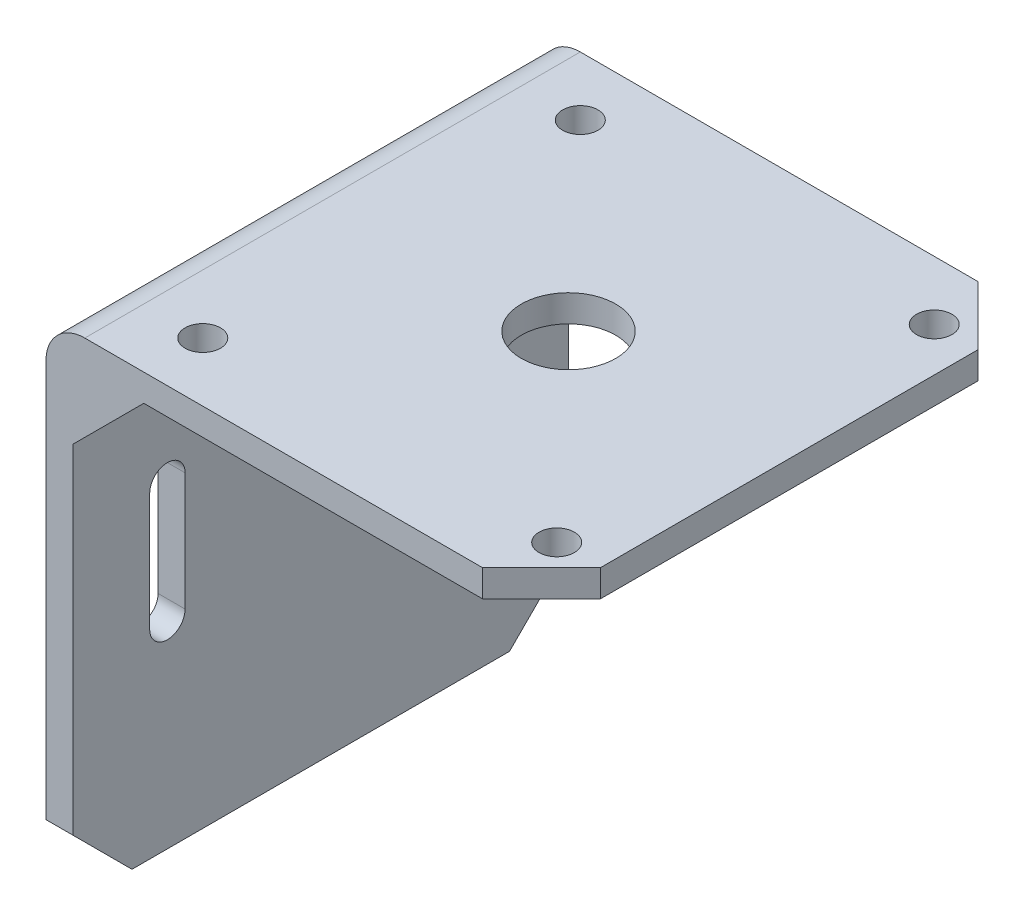
ISO-10303-21;
HEADER;
FILE_DESCRIPTION(('STEP AP214'),'2;1');
FILE_NAME('part.step','',(''),(''),'','','');
FILE_SCHEMA(('AUTOMOTIVE_DESIGN { 1 0 10303 214 1 1 1 1 }'));
ENDSEC;
DATA;
#1=APPLICATION_CONTEXT('core data for automotive mechanical design processes');
#2=APPLICATION_PROTOCOL_DEFINITION('international standard','automotive_design',2000,#1);
#3=PRODUCT_CONTEXT('',#1,'mechanical');
#4=PRODUCT('Part','Part','',(#3));
#5=PRODUCT_RELATED_PRODUCT_CATEGORY('part','',(#4));
#6=PRODUCT_DEFINITION_FORMATION('','',#4);
#7=PRODUCT_DEFINITION_CONTEXT('part definition',#1,'design');
#8=PRODUCT_DEFINITION('design','',#6,#7);
#9=PRODUCT_DEFINITION_SHAPE('','',#8);
#10=(LENGTH_UNIT() NAMED_UNIT(*) SI_UNIT(.MILLI.,.METRE.));
#11=(NAMED_UNIT(*) PLANE_ANGLE_UNIT() SI_UNIT($,.RADIAN.));
#12=(NAMED_UNIT(*) SI_UNIT($,.STERADIAN.) SOLID_ANGLE_UNIT());
#13=UNCERTAINTY_MEASURE_WITH_UNIT(LENGTH_MEASURE(1.E-05),#10,'distance_accuracy_value','');
#14=(GEOMETRIC_REPRESENTATION_CONTEXT(3) GLOBAL_UNCERTAINTY_ASSIGNED_CONTEXT((#13)) GLOBAL_UNIT_ASSIGNED_CONTEXT((#10,
#11,#12)) REPRESENTATION_CONTEXT('',''));
#15=CARTESIAN_POINT('',(0.,0.,0.));
#16=DIRECTION('',(0.,0.,1.));
#17=DIRECTION('',(1.,0.,0.));
#18=AXIS2_PLACEMENT_3D('',#15,#16,#17);
#19=CARTESIAN_POINT('',(3.29,38.71,42.));
#20=DIRECTION('',(0.,0.,-1.));
#21=DIRECTION('',(-1.,0.,0.));
#22=AXIS2_PLACEMENT_3D('',#19,#20,#21);
#23=CYLINDRICAL_SURFACE('',#22,1.);
#24=CARTESIAN_POINT('',(3.29,38.71,2.));
#25=DIRECTION('',(0.,0.,1.));
#26=DIRECTION('',(1.,0.,0.));
#27=AXIS2_PLACEMENT_3D('',#24,#25,#26);
#28=CIRCLE('',#27,1.);
#29=CARTESIAN_POINT('',(3.29,39.71,2.00000000000002));
#30=VERTEX_POINT('',#29);
#31=CARTESIAN_POINT('',(2.29,38.71,2.00000000000002));
#32=VERTEX_POINT('',#31);
#33=EDGE_CURVE('E72',#30,#32,#28,.T.);
#34=ORIENTED_EDGE('',*,*,#33,.F.);
#35=DIRECTION('',(0.,0.,-1.));
#36=VECTOR('',#35,1.);
#37=CARTESIAN_POINT('',(3.29,39.71,42.));
#38=LINE('',#37,#36);
#39=CARTESIAN_POINT('',(3.29,39.71,40.));
#40=VERTEX_POINT('',#39);
#41=EDGE_CURVE('E429',#40,#30,#38,.T.);
#42=ORIENTED_EDGE('',*,*,#41,.F.);
#43=CARTESIAN_POINT('',(3.29,38.71,40.));
#44=DIRECTION('',(0.,0.,1.));
#45=DIRECTION('',(1.,0.,0.));
#46=AXIS2_PLACEMENT_3D('',#43,#44,#45);
#47=CIRCLE('',#46,1.);
#48=CARTESIAN_POINT('',(2.29,38.71,40.));
#49=VERTEX_POINT('',#48);
#50=EDGE_CURVE('E259',#40,#49,#47,.T.);
#51=ORIENTED_EDGE('',*,*,#50,.T.);
#52=DIRECTION('',(0.,0.,-1.));
#53=VECTOR('',#52,1.);
#54=CARTESIAN_POINT('',(2.29,38.71,42.));
#55=LINE('',#54,#53);
#56=EDGE_CURVE('E444',#49,#32,#55,.T.);
#57=ORIENTED_EDGE('',*,*,#56,.T.);
#58=EDGE_LOOP('',(#34,#42,#51,#57));
#59=FACE_BOUND('',#58,.T.);
#60=ADVANCED_FACE('F47',(#59),#23,.F.);
#61=CARTESIAN_POINT('',(0.,39.71,42.));
#62=DIRECTION('',(0.,1.,0.));
#63=DIRECTION('',(0.,0.,1.));
#64=AXIS2_PLACEMENT_3D('',#61,#62,#63);
#65=PLANE('',#64);
#66=CARTESIAN_POINT('',(8.29,39.71,5.));
#67=DIRECTION('',(0.,1.,0.));
#68=DIRECTION('',(0.,0.,1.));
#69=AXIS2_PLACEMENT_3D('',#66,#67,#68);
#70=CIRCLE('',#69,1.5);
#71=CARTESIAN_POINT('',(8.29,39.71,6.5));
#72=VERTEX_POINT('',#71);
#73=EDGE_CURVE('E235',#72,#72,#70,.F.);
#74=ORIENTED_EDGE('',*,*,#73,.F.);
#75=EDGE_LOOP('',(#74));
#76=FACE_BOUND('',#75,.T.);
#77=CARTESIAN_POINT('',(23.29,39.71,21.));
#78=DIRECTION('',(0.,1.,0.));
#79=DIRECTION('',(0.,0.,1.));
#80=AXIS2_PLACEMENT_3D('',#77,#78,#79);
#81=CIRCLE('',#80,4.);
#82=CARTESIAN_POINT('',(23.29,39.71,25.));
#83=VERTEX_POINT('',#82);
#84=EDGE_CURVE('E373',#83,#83,#81,.F.);
#85=ORIENTED_EDGE('',*,*,#84,.F.);
#86=EDGE_LOOP('',(#85));
#87=FACE_BOUND('',#86,.T.);
#88=CARTESIAN_POINT('',(38.29,39.71,5.));
#89=DIRECTION('',(0.,1.,0.));
#90=DIRECTION('',(0.,0.,1.));
#91=AXIS2_PLACEMENT_3D('',#88,#89,#90);
#92=CIRCLE('',#91,1.5);
#93=CARTESIAN_POINT('',(38.29,39.71,6.5));
#94=VERTEX_POINT('',#93);
#95=EDGE_CURVE('E383',#94,#94,#92,.F.);
#96=ORIENTED_EDGE('',*,*,#95,.F.);
#97=EDGE_LOOP('',(#96));
#98=FACE_BOUND('',#97,.T.);
#99=CARTESIAN_POINT('',(38.2900000000003,39.71,37.));
#100=DIRECTION('',(0.,1.,0.));
#101=DIRECTION('',(0.,0.,1.));
#102=AXIS2_PLACEMENT_3D('',#99,#100,#101);
#103=CIRCLE('',#102,1.5);
#104=CARTESIAN_POINT('',(38.2900000000003,39.71,38.5));
#105=VERTEX_POINT('',#104);
#106=EDGE_CURVE('E391',#105,#105,#103,.F.);
#107=ORIENTED_EDGE('',*,*,#106,.F.);
#108=EDGE_LOOP('',(#107));
#109=FACE_BOUND('',#108,.T.);
#110=CARTESIAN_POINT('',(8.29000000000031,39.71,37.));
#111=DIRECTION('',(0.,1.,0.));
#112=DIRECTION('',(0.,0.,1.));
#113=AXIS2_PLACEMENT_3D('',#110,#111,#112);
#114=CIRCLE('',#113,1.5);
#115=CARTESIAN_POINT('',(8.29000000000031,39.71,38.5));
#116=VERTEX_POINT('',#115);
#117=EDGE_CURVE('E330',#116,#116,#114,.F.);
#118=ORIENTED_EDGE('',*,*,#117,.F.);
#119=EDGE_LOOP('',(#118));
#120=FACE_BOUND('',#119,.T.);
#121=DIRECTION('',(0.,0.,-1.));
#122=VECTOR('',#121,1.);
#123=CARTESIAN_POINT('',(8.29,39.71,2.));
#124=LINE('',#123,#122);
#125=CARTESIAN_POINT('',(8.29,39.71,2.));
#126=VERTEX_POINT('',#125);
#127=CARTESIAN_POINT('',(8.29,39.71,0.));
#128=VERTEX_POINT('',#127);
#129=EDGE_CURVE('E238',#126,#128,#124,.T.);
#130=ORIENTED_EDGE('',*,*,#129,.T.);
#131=DIRECTION('',(1.,0.,0.));
#132=VECTOR('',#131,1.);
#133=CARTESIAN_POINT('',(0.,39.71,0.));
#134=LINE('',#133,#132);
#135=CARTESIAN_POINT('',(37.,39.71,0.));
#136=VERTEX_POINT('',#135);
#137=EDGE_CURVE('E224',#128,#136,#134,.T.);
#138=ORIENTED_EDGE('',*,*,#137,.T.);
#139=DIRECTION('',(0.707106781186546,0.,0.707106781186549));
#140=VECTOR('',#139,1.);
#141=CARTESIAN_POINT('',(37.,39.71,0.));
#142=LINE('',#141,#140);
#143=CARTESIAN_POINT('',(42.,39.71,5.00000000000002));
#144=VERTEX_POINT('',#143);
#145=EDGE_CURVE('E516',#136,#144,#142,.T.);
#146=ORIENTED_EDGE('',*,*,#145,.T.);
#147=DIRECTION('',(0.,0.,-1.));
#148=VECTOR('',#147,1.);
#149=CARTESIAN_POINT('',(42.,39.71,42.));
#150=LINE('',#149,#148);
#151=CARTESIAN_POINT('',(42.,39.71,37.));
#152=VERTEX_POINT('',#151);
#153=EDGE_CURVE('E467',#152,#144,#150,.T.);
#154=ORIENTED_EDGE('',*,*,#153,.F.);
#155=DIRECTION('',(0.707106781186549,0.,-0.707106781186546));
#156=VECTOR('',#155,1.);
#157=CARTESIAN_POINT('',(42.,39.71,37.));
#158=LINE('',#157,#156);
#159=CARTESIAN_POINT('',(37.,39.71,42.));
#160=VERTEX_POINT('',#159);
#161=EDGE_CURVE('E512',#152,#160,#158,.F.);
#162=ORIENTED_EDGE('',*,*,#161,.T.);
#163=DIRECTION('',(1.,0.,0.));
#164=VECTOR('',#163,1.);
#165=CARTESIAN_POINT('',(0.,39.71,42.));
#166=LINE('',#165,#164);
#167=CARTESIAN_POINT('',(8.29,39.71,42.));
#168=VERTEX_POINT('',#167);
#169=EDGE_CURVE('E411',#168,#160,#166,.T.);
#170=ORIENTED_EDGE('',*,*,#169,.F.);
#171=DIRECTION('',(0.,0.,1.));
#172=VECTOR('',#171,1.);
#173=CARTESIAN_POINT('',(8.29,39.71,40.));
#174=LINE('',#173,#172);
#175=CARTESIAN_POINT('',(8.29,39.71,40.));
#176=VERTEX_POINT('',#175);
#177=EDGE_CURVE('E278',#176,#168,#174,.T.);
#178=ORIENTED_EDGE('',*,*,#177,.F.);
#179=DIRECTION('',(-1.,0.,0.));
#180=VECTOR('',#179,1.);
#181=CARTESIAN_POINT('',(8.29,39.71,40.));
#182=LINE('',#181,#180);
#183=EDGE_CURVE('E270',#176,#40,#182,.T.);
#184=ORIENTED_EDGE('',*,*,#183,.T.);
#185=ORIENTED_EDGE('',*,*,#41,.T.);
#186=DIRECTION('',(-1.,0.,0.));
#187=VECTOR('',#186,1.);
#188=CARTESIAN_POINT('',(8.29,39.71,2.));
#189=LINE('',#188,#187);
#190=EDGE_CURVE('E64',#126,#30,#189,.T.);
#191=ORIENTED_EDGE('',*,*,#190,.F.);
#192=EDGE_LOOP('',(#130,#138,#146,#154,#162,#170,#178,#184,#185,#191));
#193=FACE_BOUND('',#192,.T.);
#194=ADVANCED_FACE('F239',(#76,#87,#98,#109,#120,#193),#65,.F.);
#195=CARTESIAN_POINT('',(2.29,0.,42.));
#196=DIRECTION('',(-1.,0.,0.));
#197=DIRECTION('',(0.,0.,1.));
#198=AXIS2_PLACEMENT_3D('',#195,#196,#197);
#199=PLANE('',#198);
#200=DIRECTION('',(0.,1.,0.));
#201=VECTOR('',#200,1.);
#202=CARTESIAN_POINT('',(2.29,16.855,6.50000000000002));
#203=LINE('',#202,#201);
#204=CARTESIAN_POINT('',(2.29,16.855,6.50000000000002));
#205=VERTEX_POINT('',#204);
#206=CARTESIAN_POINT('',(2.29,26.855,6.50000000000001));
#207=VERTEX_POINT('',#206);
#208=EDGE_CURVE('E355',#205,#207,#203,.T.);
#209=ORIENTED_EDGE('',*,*,#208,.F.);
#210=CARTESIAN_POINT('',(2.29,16.855,8.00000000000002));
#211=DIRECTION('',(1.,0.,0.));
#212=DIRECTION('',(0.,0.,1.));
#213=AXIS2_PLACEMENT_3D('',#210,#211,#212);
#214=CIRCLE('',#213,1.5);
#215=CARTESIAN_POINT('',(2.29,16.855,9.50000000000002));
#216=VERTEX_POINT('',#215);
#217=EDGE_CURVE('E359',#216,#205,#214,.T.);
#218=ORIENTED_EDGE('',*,*,#217,.F.);
#219=DIRECTION('',(0.,-1.,0.));
#220=VECTOR('',#219,1.);
#221=CARTESIAN_POINT('',(2.29,16.855,9.50000000000002));
#222=LINE('',#221,#220);
#223=CARTESIAN_POINT('',(2.29,26.855,9.50000000000001));
#224=VERTEX_POINT('',#223);
#225=EDGE_CURVE('E339',#224,#216,#222,.T.);
#226=ORIENTED_EDGE('',*,*,#225,.F.);
#227=CARTESIAN_POINT('',(2.29,26.855,8.00000000000001));
#228=DIRECTION('',(1.,0.,0.));
#229=DIRECTION('',(0.,0.,1.));
#230=AXIS2_PLACEMENT_3D('',#227,#228,#229);
#231=CIRCLE('',#230,1.5);
#232=EDGE_CURVE('E351',#207,#224,#231,.T.);
#233=ORIENTED_EDGE('',*,*,#232,.F.);
#234=EDGE_LOOP('',(#209,#218,#226,#233));
#235=FACE_BOUND('',#234,.T.);
#236=DIRECTION('',(0.,1.,0.));
#237=VECTOR('',#236,1.);
#238=CARTESIAN_POINT('',(2.29,16.855,32.5));
#239=LINE('',#238,#237);
#240=CARTESIAN_POINT('',(2.29,16.855,32.5));
#241=VERTEX_POINT('',#240);
#242=CARTESIAN_POINT('',(2.29,26.855,32.5));
#243=VERTEX_POINT('',#242);
#244=EDGE_CURVE('E301',#241,#243,#239,.T.);
#245=ORIENTED_EDGE('',*,*,#244,.F.);
#246=CARTESIAN_POINT('',(2.29,16.855,34.));
#247=DIRECTION('',(1.,0.,0.));
#248=DIRECTION('',(0.,0.,-1.));
#249=AXIS2_PLACEMENT_3D('',#246,#247,#248);
#250=CIRCLE('',#249,1.5);
#251=CARTESIAN_POINT('',(2.29,16.855,35.5));
#252=VERTEX_POINT('',#251);
#253=EDGE_CURVE('E298',#252,#241,#250,.T.);
#254=ORIENTED_EDGE('',*,*,#253,.F.);
#255=DIRECTION('',(0.,-1.,0.));
#256=VECTOR('',#255,1.);
#257=CARTESIAN_POINT('',(2.29,16.855,35.5));
#258=LINE('',#257,#256);
#259=CARTESIAN_POINT('',(2.29,26.855,35.5));
#260=VERTEX_POINT('',#259);
#261=EDGE_CURVE('E309',#260,#252,#258,.T.);
#262=ORIENTED_EDGE('',*,*,#261,.F.);
#263=CARTESIAN_POINT('',(2.29,26.855,34.));
#264=DIRECTION('',(1.,0.,0.));
#265=DIRECTION('',(0.,0.,-1.));
#266=AXIS2_PLACEMENT_3D('',#263,#264,#265);
#267=CIRCLE('',#266,1.5);
#268=EDGE_CURVE('E305',#243,#260,#267,.T.);
#269=ORIENTED_EDGE('',*,*,#268,.F.);
#270=EDGE_LOOP('',(#245,#254,#262,#269));
#271=FACE_BOUND('',#270,.T.);
#272=DIRECTION('',(0.,0.,-1.));
#273=VECTOR('',#272,1.);
#274=CARTESIAN_POINT('',(2.29,33.71,2.));
#275=LINE('',#274,#273);
#276=CARTESIAN_POINT('',(2.29,33.71,2.));
#277=VERTEX_POINT('',#276);
#278=CARTESIAN_POINT('',(2.29,33.71,0.));
#279=VERTEX_POINT('',#278);
#280=EDGE_CURVE('E243',#277,#279,#275,.T.);
#281=ORIENTED_EDGE('',*,*,#280,.F.);
#282=DIRECTION('',(0.,-1.,0.));
#283=VECTOR('',#282,1.);
#284=CARTESIAN_POINT('',(2.29,38.71,2.));
#285=LINE('',#284,#283);
#286=EDGE_CURVE('E244',#32,#277,#285,.T.);
#287=ORIENTED_EDGE('',*,*,#286,.F.);
#288=ORIENTED_EDGE('',*,*,#56,.F.);
#289=DIRECTION('',(0.,-1.,0.));
#290=VECTOR('',#289,1.);
#291=CARTESIAN_POINT('',(2.29,38.71,40.));
#292=LINE('',#291,#290);
#293=CARTESIAN_POINT('',(2.29,33.71,40.));
#294=VERTEX_POINT('',#293);
#295=EDGE_CURVE('E263',#49,#294,#292,.T.);
#296=ORIENTED_EDGE('',*,*,#295,.T.);
#297=DIRECTION('',(0.,0.,1.));
#298=VECTOR('',#297,1.);
#299=CARTESIAN_POINT('',(2.29,33.71,40.));
#300=LINE('',#299,#298);
#301=CARTESIAN_POINT('',(2.29,33.71,42.));
#302=VERTEX_POINT('',#301);
#303=EDGE_CURVE('E274',#294,#302,#300,.T.);
#304=ORIENTED_EDGE('',*,*,#303,.T.);
#305=DIRECTION('',(0.,1.,0.));
#306=VECTOR('',#305,1.);
#307=CARTESIAN_POINT('',(2.29,0.,42.));
#308=LINE('',#307,#306);
#309=CARTESIAN_POINT('',(2.29,5.00000000000002,42.));
#310=VERTEX_POINT('',#309);
#311=EDGE_CURVE('E426',#310,#302,#308,.T.);
#312=ORIENTED_EDGE('',*,*,#311,.F.);
#313=DIRECTION('',(0.,0.707106781186549,0.707106781186546));
#314=VECTOR('',#313,1.);
#315=CARTESIAN_POINT('',(2.29,0.,37.));
#316=LINE('',#315,#314);
#317=CARTESIAN_POINT('',(2.29,0.,37.));
#318=VERTEX_POINT('',#317);
#319=EDGE_CURVE('E501',#310,#318,#316,.F.);
#320=ORIENTED_EDGE('',*,*,#319,.T.);
#321=DIRECTION('',(0.,0.,-1.));
#322=VECTOR('',#321,1.);
#323=CARTESIAN_POINT('',(2.29,0.,42.));
#324=LINE('',#323,#322);
#325=CARTESIAN_POINT('',(2.29,0.,5.00000000000003));
#326=VERTEX_POINT('',#325);
#327=EDGE_CURVE('E447',#318,#326,#324,.T.);
#328=ORIENTED_EDGE('',*,*,#327,.T.);
#329=DIRECTION('',(0.,-0.707106781186547,0.707106781186549));
#330=VECTOR('',#329,1.);
#331=CARTESIAN_POINT('',(2.29,5.,0.));
#332=LINE('',#331,#330);
#333=CARTESIAN_POINT('',(2.29,5.,0.));
#334=VERTEX_POINT('',#333);
#335=EDGE_CURVE('E504',#326,#334,#332,.F.);
#336=ORIENTED_EDGE('',*,*,#335,.T.);
#337=DIRECTION('',(0.,1.,0.));
#338=VECTOR('',#337,1.);
#339=CARTESIAN_POINT('',(2.29,0.,0.));
#340=LINE('',#339,#338);
#341=EDGE_CURVE('E415',#334,#279,#340,.T.);
#342=ORIENTED_EDGE('',*,*,#341,.T.);
#343=EDGE_LOOP('',(#281,#287,#288,#296,#304,#312,#320,#328,#336,#342));
#344=FACE_BOUND('',#343,.T.);
#345=ADVANCED_FACE('F557',(#235,#271,#344),#199,.F.);
#346=CARTESIAN_POINT('',(42.,42.,42.));
#347=DIRECTION('',(1.,0.,0.));
#348=DIRECTION('',(0.,0.,-1.));
#349=AXIS2_PLACEMENT_3D('',#346,#347,#348);
#350=PLANE('',#349);
#351=ORIENTED_EDGE('',*,*,#153,.T.);
#352=DIRECTION('',(0.,1.,0.));
#353=VECTOR('',#352,1.);
#354=CARTESIAN_POINT('',(42.,42.,5.00000000000001));
#355=LINE('',#354,#353);
#356=CARTESIAN_POINT('',(42.,42.,5.00000000000002));
#357=VERTEX_POINT('',#356);
#358=EDGE_CURVE('E523',#144,#357,#355,.T.);
#359=ORIENTED_EDGE('',*,*,#358,.T.);
#360=DIRECTION('',(0.,0.,-1.));
#361=VECTOR('',#360,1.);
#362=CARTESIAN_POINT('',(42.,42.,42.));
#363=LINE('',#362,#361);
#364=CARTESIAN_POINT('',(42.,42.,37.));
#365=VERTEX_POINT('',#364);
#366=EDGE_CURVE('E463',#365,#357,#363,.T.);
#367=ORIENTED_EDGE('',*,*,#366,.F.);
#368=DIRECTION('',(0.,-1.,0.));
#369=VECTOR('',#368,1.);
#370=CARTESIAN_POINT('',(42.,42.,37.));
#371=LINE('',#370,#369);
#372=EDGE_CURVE('E519',#365,#152,#371,.T.);
#373=ORIENTED_EDGE('',*,*,#372,.T.);
#374=EDGE_LOOP('',(#351,#359,#367,#373));
#375=FACE_BOUND('',#374,.T.);
#376=ADVANCED_FACE('F541',(#375),#350,.T.);
#377=CARTESIAN_POINT('',(0.,42.,42.));
#378=DIRECTION('',(0.,1.,0.));
#379=DIRECTION('',(0.,0.,1.));
#380=AXIS2_PLACEMENT_3D('',#377,#378,#379);
#381=PLANE('',#380);
#382=CARTESIAN_POINT('',(8.29000000000031,42.,37.));
#383=DIRECTION('',(0.,1.,0.));
#384=DIRECTION('',(0.,0.,1.));
#385=AXIS2_PLACEMENT_3D('',#382,#383,#384);
#386=CIRCLE('',#385,1.5);
#387=CARTESIAN_POINT('',(8.29000000000031,42.,38.5));
#388=VERTEX_POINT('',#387);
#389=EDGE_CURVE('E395',#388,#388,#386,.T.);
#390=ORIENTED_EDGE('',*,*,#389,.F.);
#391=EDGE_LOOP('',(#390));
#392=FACE_BOUND('',#391,.T.);
#393=CARTESIAN_POINT('',(38.2900000000003,42.,37.));
#394=DIRECTION('',(0.,1.,0.));
#395=DIRECTION('',(0.,0.,1.));
#396=AXIS2_PLACEMENT_3D('',#393,#394,#395);
#397=CIRCLE('',#396,1.5);
#398=CARTESIAN_POINT('',(38.2900000000003,42.,38.5));
#399=VERTEX_POINT('',#398);
#400=EDGE_CURVE('E387',#399,#399,#397,.T.);
#401=ORIENTED_EDGE('',*,*,#400,.F.);
#402=EDGE_LOOP('',(#401));
#403=FACE_BOUND('',#402,.T.);
#404=CARTESIAN_POINT('',(38.29,42.,5.));
#405=DIRECTION('',(0.,1.,0.));
#406=DIRECTION('',(0.,0.,1.));
#407=AXIS2_PLACEMENT_3D('',#404,#405,#406);
#408=CIRCLE('',#407,1.5);
#409=CARTESIAN_POINT('',(38.29,42.,6.5));
#410=VERTEX_POINT('',#409);
#411=EDGE_CURVE('E378',#410,#410,#408,.T.);
#412=ORIENTED_EDGE('',*,*,#411,.F.);
#413=EDGE_LOOP('',(#412));
#414=FACE_BOUND('',#413,.T.);
#415=CARTESIAN_POINT('',(23.29,42.,21.));
#416=DIRECTION('',(0.,1.,0.));
#417=DIRECTION('',(0.,0.,1.));
#418=AXIS2_PLACEMENT_3D('',#415,#416,#417);
#419=CIRCLE('',#418,4.);
#420=CARTESIAN_POINT('',(23.29,42.,25.));
#421=VERTEX_POINT('',#420);
#422=EDGE_CURVE('E377',#421,#421,#419,.T.);
#423=ORIENTED_EDGE('',*,*,#422,.F.);
#424=EDGE_LOOP('',(#423));
#425=FACE_BOUND('',#424,.T.);
#426=CARTESIAN_POINT('',(8.29,42.,5.));
#427=DIRECTION('',(0.,1.,0.));
#428=DIRECTION('',(0.,0.,1.));
#429=AXIS2_PLACEMENT_3D('',#426,#427,#428);
#430=CIRCLE('',#429,1.5);
#431=CARTESIAN_POINT('',(8.29,42.,6.5));
#432=VERTEX_POINT('',#431);
#433=EDGE_CURVE('E382',#432,#432,#430,.T.);
#434=ORIENTED_EDGE('',*,*,#433,.F.);
#435=EDGE_LOOP('',(#434));
#436=FACE_BOUND('',#435,.T.);
#437=ORIENTED_EDGE('',*,*,#366,.T.);
#438=DIRECTION('',(-0.707106781186546,0.,-0.707106781186549));
#439=VECTOR('',#438,1.);
#440=CARTESIAN_POINT('',(39.5000000000001,42.,2.50000000000011));
#441=LINE('',#440,#439);
#442=CARTESIAN_POINT('',(37.,42.,0.));
#443=VERTEX_POINT('',#442);
#444=EDGE_CURVE('E57',#357,#443,#441,.T.);
#445=ORIENTED_EDGE('',*,*,#444,.T.);
#446=DIRECTION('',(1.,0.,0.));
#447=VECTOR('',#446,1.);
#448=CARTESIAN_POINT('',(0.,42.,0.));
#449=LINE('',#448,#447);
#450=CARTESIAN_POINT('',(3.29,42.,0.));
#451=VERTEX_POINT('',#450);
#452=EDGE_CURVE('E234',#451,#443,#449,.T.);
#453=ORIENTED_EDGE('',*,*,#452,.F.);
#454=DIRECTION('',(0.,0.,-1.));
#455=VECTOR('',#454,1.);
#456=CARTESIAN_POINT('',(3.29,42.,42.));
#457=LINE('',#456,#455);
#458=CARTESIAN_POINT('',(3.29,42.,42.));
#459=VERTEX_POINT('',#458);
#460=EDGE_CURVE('E459',#459,#451,#457,.T.);
#461=ORIENTED_EDGE('',*,*,#460,.F.);
#462=DIRECTION('',(1.,0.,0.));
#463=VECTOR('',#462,1.);
#464=CARTESIAN_POINT('',(0.,42.,42.));
#465=LINE('',#464,#463);
#466=CARTESIAN_POINT('',(37.,42.,42.));
#467=VERTEX_POINT('',#466);
#468=EDGE_CURVE('E414',#459,#467,#465,.T.);
#469=ORIENTED_EDGE('',*,*,#468,.T.);
#470=DIRECTION('',(-0.70710678118655,0.,0.707106781186546));
#471=VECTOR('',#470,1.);
#472=CARTESIAN_POINT('',(18.4999999999999,42.,60.5));
#473=LINE('',#472,#471);
#474=EDGE_CURVE('E526',#467,#365,#473,.F.);
#475=ORIENTED_EDGE('',*,*,#474,.T.);
#476=EDGE_LOOP('',(#437,#445,#453,#461,#469,#475));
#477=FACE_BOUND('',#476,.T.);
#478=ADVANCED_FACE('F533',(#392,#403,#414,#425,#436,#477),#381,.T.);
#479=CARTESIAN_POINT('',(3.29,38.71,42.));
#480=DIRECTION('',(0.,0.,-1.));
#481=DIRECTION('',(-1.,0.,0.));
#482=AXIS2_PLACEMENT_3D('',#479,#480,#481);
#483=CYLINDRICAL_SURFACE('',#482,3.29);
#484=CARTESIAN_POINT('',(3.29,38.71,0.));
#485=DIRECTION('',(0.,0.,1.));
#486=DIRECTION('',(1.,0.,0.));
#487=AXIS2_PLACEMENT_3D('',#484,#485,#486);
#488=CIRCLE('',#487,3.29);
#489=CARTESIAN_POINT('',(0.,38.71,0.));
#490=VERTEX_POINT('',#489);
#491=EDGE_CURVE('E433',#490,#451,#488,.F.);
#492=ORIENTED_EDGE('',*,*,#491,.F.);
#493=DIRECTION('',(0.,0.,-1.));
#494=VECTOR('',#493,1.);
#495=CARTESIAN_POINT('',(0.,38.71,42.));
#496=LINE('',#495,#494);
#497=CARTESIAN_POINT('',(0.,38.71,42.));
#498=VERTEX_POINT('',#497);
#499=EDGE_CURVE('E455',#498,#490,#496,.T.);
#500=ORIENTED_EDGE('',*,*,#499,.F.);
#501=CARTESIAN_POINT('',(3.29,38.71,42.));
#502=DIRECTION('',(0.,0.,1.));
#503=DIRECTION('',(1.,0.,0.));
#504=AXIS2_PLACEMENT_3D('',#501,#502,#503);
#505=CIRCLE('',#504,3.29);
#506=EDGE_CURVE('E419',#498,#459,#505,.F.);
#507=ORIENTED_EDGE('',*,*,#506,.T.);
#508=ORIENTED_EDGE('',*,*,#460,.T.);
#509=EDGE_LOOP('',(#492,#500,#507,#508));
#510=FACE_BOUND('',#509,.T.);
#511=ADVANCED_FACE('F594',(#510),#483,.T.);
#512=CARTESIAN_POINT('',(0.,0.,42.));
#513=DIRECTION('',(-1.,0.,0.));
#514=DIRECTION('',(0.,0.,1.));
#515=AXIS2_PLACEMENT_3D('',#512,#513,#514);
#516=PLANE('',#515);
#517=CARTESIAN_POINT('',(0.,16.855,34.));
#518=DIRECTION('',(-1.,0.,0.));
#519=DIRECTION('',(0.,0.,1.));
#520=AXIS2_PLACEMENT_3D('',#517,#518,#519);
#521=CIRCLE('',#520,1.5);
#522=CARTESIAN_POINT('',(0.,16.855,35.5));
#523=VERTEX_POINT('',#522);
#524=CARTESIAN_POINT('',(0.,16.855,32.5));
#525=VERTEX_POINT('',#524);
#526=EDGE_CURVE('E294',#523,#525,#521,.F.);
#527=ORIENTED_EDGE('',*,*,#526,.T.);
#528=DIRECTION('',(0.,1.,0.));
#529=VECTOR('',#528,1.);
#530=CARTESIAN_POINT('',(0.,16.855,32.5));
#531=LINE('',#530,#529);
#532=CARTESIAN_POINT('',(0.,26.855,32.5));
#533=VERTEX_POINT('',#532);
#534=EDGE_CURVE('E317',#525,#533,#531,.T.);
#535=ORIENTED_EDGE('',*,*,#534,.T.);
#536=CARTESIAN_POINT('',(0.,26.855,34.));
#537=DIRECTION('',(-1.,0.,0.));
#538=DIRECTION('',(0.,0.,1.));
#539=AXIS2_PLACEMENT_3D('',#536,#537,#538);
#540=CIRCLE('',#539,1.5);
#541=CARTESIAN_POINT('',(0.,26.855,35.5));
#542=VERTEX_POINT('',#541);
#543=EDGE_CURVE('E285',#533,#542,#540,.F.);
#544=ORIENTED_EDGE('',*,*,#543,.T.);
#545=DIRECTION('',(0.,-1.,0.));
#546=VECTOR('',#545,1.);
#547=CARTESIAN_POINT('',(0.,16.855,35.5));
#548=LINE('',#547,#546);
#549=EDGE_CURVE('E289',#542,#523,#548,.T.);
#550=ORIENTED_EDGE('',*,*,#549,.T.);
#551=EDGE_LOOP('',(#527,#535,#544,#550));
#552=FACE_BOUND('',#551,.T.);
#553=CARTESIAN_POINT('',(0.,16.855,8.00000000000002));
#554=DIRECTION('',(-1.,0.,0.));
#555=DIRECTION('',(0.,0.,1.));
#556=AXIS2_PLACEMENT_3D('',#553,#554,#555);
#557=CIRCLE('',#556,1.5);
#558=CARTESIAN_POINT('',(0.,16.855,9.50000000000002));
#559=VERTEX_POINT('',#558);
#560=CARTESIAN_POINT('',(0.,16.855,6.50000000000002));
#561=VERTEX_POINT('',#560);
#562=EDGE_CURVE('E362',#559,#561,#557,.F.);
#563=ORIENTED_EDGE('',*,*,#562,.T.);
#564=DIRECTION('',(0.,1.,0.));
#565=VECTOR('',#564,1.);
#566=CARTESIAN_POINT('',(0.,16.855,6.50000000000002));
#567=LINE('',#566,#565);
#568=CARTESIAN_POINT('',(0.,26.855,6.50000000000001));
#569=VERTEX_POINT('',#568);
#570=EDGE_CURVE('E281',#561,#569,#567,.T.);
#571=ORIENTED_EDGE('',*,*,#570,.T.);
#572=CARTESIAN_POINT('',(0.,26.855,8.00000000000001));
#573=DIRECTION('',(-1.,0.,0.));
#574=DIRECTION('',(0.,0.,1.));
#575=AXIS2_PLACEMENT_3D('',#572,#573,#574);
#576=CIRCLE('',#575,1.5);
#577=CARTESIAN_POINT('',(0.,26.855,9.50000000000001));
#578=VERTEX_POINT('',#577);
#579=EDGE_CURVE('E290',#569,#578,#576,.F.);
#580=ORIENTED_EDGE('',*,*,#579,.T.);
#581=DIRECTION('',(0.,-1.,0.));
#582=VECTOR('',#581,1.);
#583=CARTESIAN_POINT('',(0.,16.855,9.50000000000002));
#584=LINE('',#583,#582);
#585=EDGE_CURVE('E366',#578,#559,#584,.T.);
#586=ORIENTED_EDGE('',*,*,#585,.T.);
#587=EDGE_LOOP('',(#563,#571,#580,#586));
#588=FACE_BOUND('',#587,.T.);
#589=DIRECTION('',(0.,1.,0.));
#590=VECTOR('',#589,1.);
#591=CARTESIAN_POINT('',(0.,0.,0.));
#592=LINE('',#591,#590);
#593=CARTESIAN_POINT('',(0.,5.,0.));
#594=VERTEX_POINT('',#593);
#595=EDGE_CURVE('E437',#594,#490,#592,.T.);
#596=ORIENTED_EDGE('',*,*,#595,.F.);
#597=DIRECTION('',(0.,0.707106781186547,-0.707106781186549));
#598=VECTOR('',#597,1.);
#599=CARTESIAN_POINT('',(0.,-18.5,23.5000000000001));
#600=LINE('',#599,#598);
#601=CARTESIAN_POINT('',(0.,0.,5.00000000000003));
#602=VERTEX_POINT('',#601);
#603=EDGE_CURVE('E491',#594,#602,#600,.F.);
#604=ORIENTED_EDGE('',*,*,#603,.T.);
#605=DIRECTION('',(0.,0.,-1.));
#606=VECTOR('',#605,1.);
#607=CARTESIAN_POINT('',(0.,0.,42.));
#608=LINE('',#607,#606);
#609=CARTESIAN_POINT('',(0.,0.,37.));
#610=VERTEX_POINT('',#609);
#611=EDGE_CURVE('E451',#610,#602,#608,.T.);
#612=ORIENTED_EDGE('',*,*,#611,.F.);
#613=DIRECTION('',(0.,-0.70710678118655,-0.707106781186546));
#614=VECTOR('',#613,1.);
#615=CARTESIAN_POINT('',(0.,2.5,39.5));
#616=LINE('',#615,#614);
#617=CARTESIAN_POINT('',(0.,5.00000000000002,42.));
#618=VERTEX_POINT('',#617);
#619=EDGE_CURVE('E488',#610,#618,#616,.F.);
#620=ORIENTED_EDGE('',*,*,#619,.T.);
#621=DIRECTION('',(0.,1.,0.));
#622=VECTOR('',#621,1.);
#623=CARTESIAN_POINT('',(0.,0.,42.));
#624=LINE('',#623,#622);
#625=EDGE_CURVE('E423',#618,#498,#624,.T.);
#626=ORIENTED_EDGE('',*,*,#625,.T.);
#627=ORIENTED_EDGE('',*,*,#499,.T.);
#628=EDGE_LOOP('',(#596,#604,#612,#620,#626,#627));
#629=FACE_BOUND('',#628,.T.);
#630=ADVANCED_FACE('F582',(#552,#588,#629),#516,.T.);
#631=CARTESIAN_POINT('',(2.29,0.,42.));
#632=DIRECTION('',(0.,-1.,0.));
#633=DIRECTION('',(0.,0.,-1.));
#634=AXIS2_PLACEMENT_3D('',#631,#632,#633);
#635=PLANE('',#634);
#636=ORIENTED_EDGE('',*,*,#611,.T.);
#637=DIRECTION('',(1.,0.,0.));
#638=VECTOR('',#637,1.);
#639=CARTESIAN_POINT('',(2.29,0.,5.00000000000002));
#640=LINE('',#639,#638);
#641=EDGE_CURVE('E498',#602,#326,#640,.T.);
#642=ORIENTED_EDGE('',*,*,#641,.T.);
#643=ORIENTED_EDGE('',*,*,#327,.F.);
#644=DIRECTION('',(-1.,0.,0.));
#645=VECTOR('',#644,1.);
#646=CARTESIAN_POINT('',(2.29,0.,37.));
#647=LINE('',#646,#645);
#648=EDGE_CURVE('E494',#318,#610,#647,.T.);
#649=ORIENTED_EDGE('',*,*,#648,.T.);
#650=EDGE_LOOP('',(#636,#642,#643,#649));
#651=FACE_BOUND('',#650,.T.);
#652=ADVANCED_FACE('F584',(#651),#635,.T.);
#653=CARTESIAN_POINT('',(3.29,38.71,42.));
#654=DIRECTION('',(0.,0.,1.));
#655=DIRECTION('',(1.,0.,0.));
#656=AXIS2_PLACEMENT_3D('',#653,#654,#655);
#657=PLANE('',#656);
#658=ORIENTED_EDGE('',*,*,#625,.F.);
#659=DIRECTION('',(1.,0.,0.));
#660=VECTOR('',#659,1.);
#661=CARTESIAN_POINT('',(3.29,5.00000000000002,42.));
#662=LINE('',#661,#660);
#663=EDGE_CURVE('E507',#618,#310,#662,.T.);
#664=ORIENTED_EDGE('',*,*,#663,.T.);
#665=ORIENTED_EDGE('',*,*,#311,.T.);
#666=DIRECTION('',(0.707106781186546,0.707106781186548,0.));
#667=VECTOR('',#666,1.);
#668=CARTESIAN_POINT('',(2.29,33.71,42.));
#669=LINE('',#668,#667);
#670=EDGE_CURVE('E257',#302,#168,#669,.T.);
#671=ORIENTED_EDGE('',*,*,#670,.T.);
#672=ORIENTED_EDGE('',*,*,#169,.T.);
#673=DIRECTION('',(0.,1.,0.));
#674=VECTOR('',#673,1.);
#675=CARTESIAN_POINT('',(37.,38.71,42.));
#676=LINE('',#675,#674);
#677=EDGE_CURVE('E11',#160,#467,#676,.T.);
#678=ORIENTED_EDGE('',*,*,#677,.T.);
#679=ORIENTED_EDGE('',*,*,#468,.F.);
#680=ORIENTED_EDGE('',*,*,#506,.F.);
#681=EDGE_LOOP('',(#658,#664,#665,#671,#672,#678,#679,#680));
#682=FACE_BOUND('',#681,.T.);
#683=ADVANCED_FACE('F550',(#682),#657,.T.);
#684=CARTESIAN_POINT('',(3.29,38.71,0.));
#685=DIRECTION('',(0.,0.,1.));
#686=DIRECTION('',(1.,0.,0.));
#687=AXIS2_PLACEMENT_3D('',#684,#685,#686);
#688=PLANE('',#687);
#689=ORIENTED_EDGE('',*,*,#452,.T.);
#690=DIRECTION('',(0.,-1.,0.));
#691=VECTOR('',#690,1.);
#692=CARTESIAN_POINT('',(37.,39.71,0.));
#693=LINE('',#692,#691);
#694=EDGE_CURVE('E231',#443,#136,#693,.T.);
#695=ORIENTED_EDGE('',*,*,#694,.T.);
#696=ORIENTED_EDGE('',*,*,#137,.F.);
#697=DIRECTION('',(0.707106781186546,0.707106781186548,0.));
#698=VECTOR('',#697,1.);
#699=CARTESIAN_POINT('',(2.29,33.71,0.));
#700=LINE('',#699,#698);
#701=EDGE_CURVE('E229',#279,#128,#700,.T.);
#702=ORIENTED_EDGE('',*,*,#701,.F.);
#703=ORIENTED_EDGE('',*,*,#341,.F.);
#704=DIRECTION('',(-1.,0.,0.));
#705=VECTOR('',#704,1.);
#706=CARTESIAN_POINT('',(3.29,5.,0.));
#707=LINE('',#706,#705);
#708=EDGE_CURVE('E484',#334,#594,#707,.T.);
#709=ORIENTED_EDGE('',*,*,#708,.T.);
#710=ORIENTED_EDGE('',*,*,#595,.T.);
#711=ORIENTED_EDGE('',*,*,#491,.T.);
#712=EDGE_LOOP('',(#689,#695,#696,#702,#703,#709,#710,#711));
#713=FACE_BOUND('',#712,.T.);
#714=ADVANCED_FACE('F226',(#713),#688,.F.);
#715=CARTESIAN_POINT('',(3.29,5.,0.));
#716=DIRECTION('',(0.,0.707106781186549,0.707106781186547));
#717=DIRECTION('',(-1.,0.,0.));
#718=AXIS2_PLACEMENT_3D('',#715,#716,#717);
#719=PLANE('',#718);
#720=ORIENTED_EDGE('',*,*,#335,.F.);
#721=ORIENTED_EDGE('',*,*,#641,.F.);
#722=ORIENTED_EDGE('',*,*,#603,.F.);
#723=ORIENTED_EDGE('',*,*,#708,.F.);
#724=EDGE_LOOP('',(#720,#721,#722,#723));
#725=FACE_BOUND('',#724,.T.);
#726=ADVANCED_FACE('F578',(#725),#719,.F.);
#727=CARTESIAN_POINT('',(2.29,0.,37.));
#728=DIRECTION('',(0.,0.707106781186546,-0.70710678118655));
#729=DIRECTION('',(-1.,0.,0.));
#730=AXIS2_PLACEMENT_3D('',#727,#728,#729);
#731=PLANE('',#730);
#732=ORIENTED_EDGE('',*,*,#319,.F.);
#733=ORIENTED_EDGE('',*,*,#663,.F.);
#734=ORIENTED_EDGE('',*,*,#619,.F.);
#735=ORIENTED_EDGE('',*,*,#648,.F.);
#736=EDGE_LOOP('',(#732,#733,#734,#735));
#737=FACE_BOUND('',#736,.T.);
#738=ADVANCED_FACE('F588',(#737),#731,.F.);
#739=CARTESIAN_POINT('',(37.,38.71,0.));
#740=DIRECTION('',(0.707106781186549,0.,-0.707106781186546));
#741=DIRECTION('',(0.,1.,0.));
#742=AXIS2_PLACEMENT_3D('',#739,#740,#741);
#743=PLANE('',#742);
#744=ORIENTED_EDGE('',*,*,#444,.F.);
#745=ORIENTED_EDGE('',*,*,#358,.F.);
#746=ORIENTED_EDGE('',*,*,#145,.F.);
#747=ORIENTED_EDGE('',*,*,#694,.F.);
#748=EDGE_LOOP('',(#744,#745,#746,#747));
#749=FACE_BOUND('',#748,.T.);
#750=ADVANCED_FACE('F538',(#749),#743,.T.);
#751=CARTESIAN_POINT('',(42.,42.,37.));
#752=DIRECTION('',(-0.707106781186546,0.,-0.70710678118655));
#753=DIRECTION('',(0.,-1.,0.));
#754=AXIS2_PLACEMENT_3D('',#751,#752,#753);
#755=PLANE('',#754);
#756=ORIENTED_EDGE('',*,*,#474,.F.);
#757=ORIENTED_EDGE('',*,*,#677,.F.);
#758=ORIENTED_EDGE('',*,*,#161,.F.);
#759=ORIENTED_EDGE('',*,*,#372,.F.);
#760=EDGE_LOOP('',(#756,#757,#758,#759));
#761=FACE_BOUND('',#760,.T.);
#762=ADVANCED_FACE('F50',(#761),#755,.F.);
#763=CARTESIAN_POINT('',(8.29,-0.001000000000001,5.));
#764=DIRECTION('',(0.,1.,0.));
#765=DIRECTION('',(0.,0.,1.));
#766=AXIS2_PLACEMENT_3D('',#763,#764,#765);
#767=CYLINDRICAL_SURFACE('',#766,1.5);
#768=ORIENTED_EDGE('',*,*,#433,.T.);
#769=EDGE_LOOP('',(#768));
#770=FACE_BOUND('',#769,.T.);
#771=ORIENTED_EDGE('',*,*,#73,.T.);
#772=EDGE_LOOP('',(#771));
#773=FACE_BOUND('',#772,.T.);
#774=ADVANCED_FACE('F632',(#770,#773),#767,.F.);
#775=CARTESIAN_POINT('',(23.29,-0.001000000000001,21.));
#776=DIRECTION('',(0.,1.,0.));
#777=DIRECTION('',(0.,0.,1.));
#778=AXIS2_PLACEMENT_3D('',#775,#776,#777);
#779=CYLINDRICAL_SURFACE('',#778,4.);
#780=ORIENTED_EDGE('',*,*,#422,.T.);
#781=EDGE_LOOP('',(#780));
#782=FACE_BOUND('',#781,.T.);
#783=ORIENTED_EDGE('',*,*,#84,.T.);
#784=EDGE_LOOP('',(#783));
#785=FACE_BOUND('',#784,.T.);
#786=ADVANCED_FACE('F635',(#782,#785),#779,.F.);
#787=CARTESIAN_POINT('',(38.29,-0.001000000000001,5.));
#788=DIRECTION('',(0.,1.,0.));
#789=DIRECTION('',(0.,0.,1.));
#790=AXIS2_PLACEMENT_3D('',#787,#788,#789);
#791=CYLINDRICAL_SURFACE('',#790,1.5);
#792=ORIENTED_EDGE('',*,*,#411,.T.);
#793=EDGE_LOOP('',(#792));
#794=FACE_BOUND('',#793,.T.);
#795=ORIENTED_EDGE('',*,*,#95,.T.);
#796=EDGE_LOOP('',(#795));
#797=FACE_BOUND('',#796,.T.);
#798=ADVANCED_FACE('F645',(#794,#797),#791,.F.);
#799=CARTESIAN_POINT('',(38.2900000000003,-0.001000000000001,37.));
#800=DIRECTION('',(0.,1.,0.));
#801=DIRECTION('',(0.,0.,1.));
#802=AXIS2_PLACEMENT_3D('',#799,#800,#801);
#803=CYLINDRICAL_SURFACE('',#802,1.5);
#804=ORIENTED_EDGE('',*,*,#400,.T.);
#805=EDGE_LOOP('',(#804));
#806=FACE_BOUND('',#805,.T.);
#807=ORIENTED_EDGE('',*,*,#106,.T.);
#808=EDGE_LOOP('',(#807));
#809=FACE_BOUND('',#808,.T.);
#810=ADVANCED_FACE('F641',(#806,#809),#803,.F.);
#811=CARTESIAN_POINT('',(8.29000000000031,-0.001000000000001,37.));
#812=DIRECTION('',(0.,1.,0.));
#813=DIRECTION('',(0.,0.,1.));
#814=AXIS2_PLACEMENT_3D('',#811,#812,#813);
#815=CYLINDRICAL_SURFACE('',#814,1.5);
#816=ORIENTED_EDGE('',*,*,#389,.T.);
#817=EDGE_LOOP('',(#816));
#818=FACE_BOUND('',#817,.T.);
#819=ORIENTED_EDGE('',*,*,#117,.T.);
#820=EDGE_LOOP('',(#819));
#821=FACE_BOUND('',#820,.T.);
#822=ADVANCED_FACE('F637',(#818,#821),#815,.F.);
#823=CARTESIAN_POINT('',(-0.00100000000000013,16.855,8.00000000000002));
#824=DIRECTION('',(1.,0.,0.));
#825=DIRECTION('',(0.,0.,-1.));
#826=AXIS2_PLACEMENT_3D('',#823,#824,#825);
#827=CYLINDRICAL_SURFACE('',#826,1.5);
#828=DIRECTION('',(1.,0.,0.));
#829=VECTOR('',#828,1.);
#830=CARTESIAN_POINT('',(-0.00100000000000013,16.855,9.50000000000002));
#831=LINE('',#830,#829);
#832=EDGE_CURVE('E334',#559,#216,#831,.T.);
#833=ORIENTED_EDGE('',*,*,#832,.T.);
#834=ORIENTED_EDGE('',*,*,#217,.T.);
#835=DIRECTION('',(1.,0.,0.));
#836=VECTOR('',#835,1.);
#837=CARTESIAN_POINT('',(-0.00100000000000013,16.855,6.50000000000002));
#838=LINE('',#837,#836);
#839=EDGE_CURVE('E335',#561,#205,#838,.T.);
#840=ORIENTED_EDGE('',*,*,#839,.F.);
#841=ORIENTED_EDGE('',*,*,#562,.F.);
#842=EDGE_LOOP('',(#833,#834,#840,#841));
#843=FACE_BOUND('',#842,.T.);
#844=ADVANCED_FACE('F640',(#843),#827,.F.);
#845=CARTESIAN_POINT('',(-0.00100000000000013,16.855,9.50000000000002));
#846=DIRECTION('',(0.,0.,1.));
#847=DIRECTION('',(0.,-1.,0.));
#848=AXIS2_PLACEMENT_3D('',#845,#846,#847);
#849=PLANE('',#848);
#850=DIRECTION('',(1.,0.,0.));
#851=VECTOR('',#850,1.);
#852=CARTESIAN_POINT('',(-0.00100000000000013,26.855,9.50000000000001));
#853=LINE('',#852,#851);
#854=EDGE_CURVE('E343',#578,#224,#853,.T.);
#855=ORIENTED_EDGE('',*,*,#854,.T.);
#856=ORIENTED_EDGE('',*,*,#225,.T.);
#857=ORIENTED_EDGE('',*,*,#832,.F.);
#858=ORIENTED_EDGE('',*,*,#585,.F.);
#859=EDGE_LOOP('',(#855,#856,#857,#858));
#860=FACE_BOUND('',#859,.T.);
#861=ADVANCED_FACE('F653',(#860),#849,.F.);
#862=CARTESIAN_POINT('',(-0.00100000000000013,26.855,8.00000000000001));
#863=DIRECTION('',(1.,0.,0.));
#864=DIRECTION('',(0.,0.,-1.));
#865=AXIS2_PLACEMENT_3D('',#862,#863,#864);
#866=CYLINDRICAL_SURFACE('',#865,1.5);
#867=DIRECTION('',(1.,0.,0.));
#868=VECTOR('',#867,1.);
#869=CARTESIAN_POINT('',(-0.00100000000000013,26.855,6.50000000000001));
#870=LINE('',#869,#868);
#871=EDGE_CURVE('E340',#569,#207,#870,.T.);
#872=ORIENTED_EDGE('',*,*,#871,.T.);
#873=ORIENTED_EDGE('',*,*,#232,.T.);
#874=ORIENTED_EDGE('',*,*,#854,.F.);
#875=ORIENTED_EDGE('',*,*,#579,.F.);
#876=EDGE_LOOP('',(#872,#873,#874,#875));
#877=FACE_BOUND('',#876,.T.);
#878=ADVANCED_FACE('F656',(#877),#866,.F.);
#879=CARTESIAN_POINT('',(-0.00100000000000013,16.855,6.50000000000002));
#880=DIRECTION('',(0.,0.,-1.));
#881=DIRECTION('',(0.,1.,0.));
#882=AXIS2_PLACEMENT_3D('',#879,#880,#881);
#883=PLANE('',#882);
#884=ORIENTED_EDGE('',*,*,#839,.T.);
#885=ORIENTED_EDGE('',*,*,#208,.T.);
#886=ORIENTED_EDGE('',*,*,#871,.F.);
#887=ORIENTED_EDGE('',*,*,#570,.F.);
#888=EDGE_LOOP('',(#884,#885,#886,#887));
#889=FACE_BOUND('',#888,.T.);
#890=ADVANCED_FACE('F660',(#889),#883,.F.);
#891=CARTESIAN_POINT('',(-0.00100000000000013,16.855,34.));
#892=DIRECTION('',(1.,0.,0.));
#893=DIRECTION('',(0.,0.,-1.));
#894=AXIS2_PLACEMENT_3D('',#891,#892,#893);
#895=CYLINDRICAL_SURFACE('',#894,1.5);
#896=DIRECTION('',(1.,0.,0.));
#897=VECTOR('',#896,1.);
#898=CARTESIAN_POINT('',(-0.00100000000000013,16.855,35.5));
#899=LINE('',#898,#897);
#900=EDGE_CURVE('E314',#523,#252,#899,.T.);
#901=ORIENTED_EDGE('',*,*,#900,.T.);
#902=ORIENTED_EDGE('',*,*,#253,.T.);
#903=DIRECTION('',(1.,0.,0.));
#904=VECTOR('',#903,1.);
#905=CARTESIAN_POINT('',(-0.00100000000000013,16.855,32.5));
#906=LINE('',#905,#904);
#907=EDGE_CURVE('E313',#525,#241,#906,.T.);
#908=ORIENTED_EDGE('',*,*,#907,.F.);
#909=ORIENTED_EDGE('',*,*,#526,.F.);
#910=EDGE_LOOP('',(#901,#902,#908,#909));
#911=FACE_BOUND('',#910,.T.);
#912=ADVANCED_FACE('F664',(#911),#895,.F.);
#913=CARTESIAN_POINT('',(-0.00100000000000013,16.855,35.5));
#914=DIRECTION('',(0.,0.,1.));
#915=DIRECTION('',(1.,0.,0.));
#916=AXIS2_PLACEMENT_3D('',#913,#914,#915);
#917=PLANE('',#916);
#918=DIRECTION('',(1.,0.,0.));
#919=VECTOR('',#918,1.);
#920=CARTESIAN_POINT('',(-0.00100000000000013,26.855,35.5));
#921=LINE('',#920,#919);
#922=EDGE_CURVE('E318',#542,#260,#921,.T.);
#923=ORIENTED_EDGE('',*,*,#922,.T.);
#924=ORIENTED_EDGE('',*,*,#261,.T.);
#925=ORIENTED_EDGE('',*,*,#900,.F.);
#926=ORIENTED_EDGE('',*,*,#549,.F.);
#927=EDGE_LOOP('',(#923,#924,#925,#926));
#928=FACE_BOUND('',#927,.T.);
#929=ADVANCED_FACE('F671',(#928),#917,.F.);
#930=CARTESIAN_POINT('',(-0.00100000000000013,26.855,34.));
#931=DIRECTION('',(1.,0.,0.));
#932=DIRECTION('',(0.,0.,-1.));
#933=AXIS2_PLACEMENT_3D('',#930,#931,#932);
#934=CYLINDRICAL_SURFACE('',#933,1.5);
#935=DIRECTION('',(1.,0.,0.));
#936=VECTOR('',#935,1.);
#937=CARTESIAN_POINT('',(-0.00100000000000013,26.855,32.5));
#938=LINE('',#937,#936);
#939=EDGE_CURVE('E321',#533,#243,#938,.T.);
#940=ORIENTED_EDGE('',*,*,#939,.T.);
#941=ORIENTED_EDGE('',*,*,#268,.T.);
#942=ORIENTED_EDGE('',*,*,#922,.F.);
#943=ORIENTED_EDGE('',*,*,#543,.F.);
#944=EDGE_LOOP('',(#940,#941,#942,#943));
#945=FACE_BOUND('',#944,.T.);
#946=ADVANCED_FACE('F675',(#945),#934,.F.);
#947=CARTESIAN_POINT('',(-0.00100000000000013,16.855,32.5));
#948=DIRECTION('',(0.,0.,-1.));
#949=DIRECTION('',(-1.,0.,0.));
#950=AXIS2_PLACEMENT_3D('',#947,#948,#949);
#951=PLANE('',#950);
#952=ORIENTED_EDGE('',*,*,#907,.T.);
#953=ORIENTED_EDGE('',*,*,#244,.T.);
#954=ORIENTED_EDGE('',*,*,#939,.F.);
#955=ORIENTED_EDGE('',*,*,#534,.F.);
#956=EDGE_LOOP('',(#952,#953,#954,#955));
#957=FACE_BOUND('',#956,.T.);
#958=ADVANCED_FACE('F673',(#957),#951,.F.);
#959=CARTESIAN_POINT('',(2.29,33.71,40.));
#960=DIRECTION('',(0.707106781186549,-0.707106781186546,0.));
#961=DIRECTION('',(0.707106781186546,0.707106781186549,0.));
#962=AXIS2_PLACEMENT_3D('',#959,#960,#961);
#963=PLANE('',#962);
#964=ORIENTED_EDGE('',*,*,#670,.F.);
#965=ORIENTED_EDGE('',*,*,#303,.F.);
#966=DIRECTION('',(0.707106781186546,0.707106781186548,0.));
#967=VECTOR('',#966,1.);
#968=CARTESIAN_POINT('',(2.29,33.71,40.));
#969=LINE('',#968,#967);
#970=EDGE_CURVE('E267',#294,#176,#969,.T.);
#971=ORIENTED_EDGE('',*,*,#970,.T.);
#972=ORIENTED_EDGE('',*,*,#177,.T.);
#973=EDGE_LOOP('',(#964,#965,#971,#972));
#974=FACE_BOUND('',#973,.T.);
#975=ADVANCED_FACE('F554',(#974),#963,.T.);
#976=CARTESIAN_POINT('',(3.29,38.71,40.));
#977=DIRECTION('',(0.,0.,1.));
#978=DIRECTION('',(1.,0.,0.));
#979=AXIS2_PLACEMENT_3D('',#976,#977,#978);
#980=PLANE('',#979);
#981=ORIENTED_EDGE('',*,*,#50,.F.);
#982=ORIENTED_EDGE('',*,*,#183,.F.);
#983=ORIENTED_EDGE('',*,*,#970,.F.);
#984=ORIENTED_EDGE('',*,*,#295,.F.);
#985=EDGE_LOOP('',(#981,#982,#983,#984));
#986=FACE_BOUND('',#985,.T.);
#987=ADVANCED_FACE('F561',(#986),#980,.F.);
#988=CARTESIAN_POINT('',(2.29,33.71,2.));
#989=DIRECTION('',(-0.707106781186549,0.707106781186546,0.));
#990=DIRECTION('',(-0.707106781186546,-0.707106781186549,0.));
#991=AXIS2_PLACEMENT_3D('',#988,#989,#990);
#992=PLANE('',#991);
#993=ORIENTED_EDGE('',*,*,#701,.T.);
#994=ORIENTED_EDGE('',*,*,#129,.F.);
#995=DIRECTION('',(0.707106781186546,0.707106781186548,0.));
#996=VECTOR('',#995,1.);
#997=CARTESIAN_POINT('',(2.29,33.71,2.));
#998=LINE('',#997,#996);
#999=EDGE_CURVE('E566',#277,#126,#998,.T.);
#1000=ORIENTED_EDGE('',*,*,#999,.F.);
#1001=ORIENTED_EDGE('',*,*,#280,.T.);
#1002=EDGE_LOOP('',(#993,#994,#1000,#1001));
#1003=FACE_BOUND('',#1002,.T.);
#1004=ADVANCED_FACE('F247',(#1003),#992,.F.);
#1005=CARTESIAN_POINT('',(3.29,38.71,2.));
#1006=DIRECTION('',(0.,0.,-1.));
#1007=DIRECTION('',(1.,0.,0.));
#1008=AXIS2_PLACEMENT_3D('',#1005,#1006,#1007);
#1009=PLANE('',#1008);
#1010=ORIENTED_EDGE('',*,*,#33,.T.);
#1011=ORIENTED_EDGE('',*,*,#286,.T.);
#1012=ORIENTED_EDGE('',*,*,#999,.T.);
#1013=ORIENTED_EDGE('',*,*,#190,.T.);
#1014=EDGE_LOOP('',(#1010,#1011,#1012,#1013));
#1015=FACE_BOUND('',#1014,.T.);
#1016=ADVANCED_FACE('F564',(#1015),#1009,.F.);
#1017=CLOSED_SHELL('',(#60,#194,#345,#376,#478,#511,#630,#652,#683,#714,#726,#738,#750,#762,
#774,#786,#798,#810,#822,#844,#861,#878,#890,#912,#929,#946,#958,#975,#987,#1004,#1016));
#1018=MANIFOLD_SOLID_BREP('B2',#1017);
#1019=ADVANCED_BREP_SHAPE_REPRESENTATION('',(#18,#1018),#14);
#1020=SHAPE_DEFINITION_REPRESENTATION(#9,#1019);
ENDSEC;
END-ISO-10303-21;
